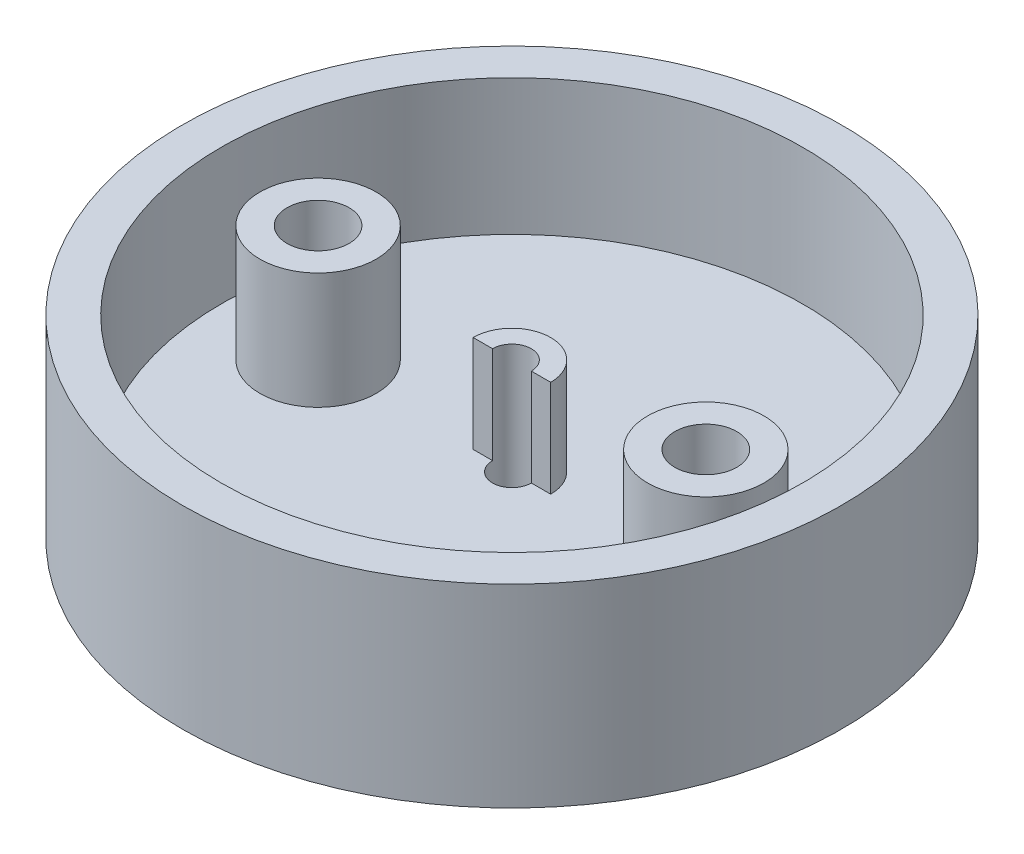
ISO-10303-21;
HEADER;
FILE_DESCRIPTION(('STEP AP214'),'2;1');
FILE_NAME('part.step','',(''),(''),'','','');
FILE_SCHEMA(('AUTOMOTIVE_DESIGN { 1 0 10303 214 1 1 1 1 }'));
ENDSEC;
DATA;
#1=APPLICATION_CONTEXT('core data for automotive mechanical design processes');
#2=APPLICATION_PROTOCOL_DEFINITION('international standard','automotive_design',2000,#1);
#3=PRODUCT_CONTEXT('',#1,'mechanical');
#4=PRODUCT('Part','Part','',(#3));
#5=PRODUCT_RELATED_PRODUCT_CATEGORY('part','',(#4));
#6=PRODUCT_DEFINITION_FORMATION('','',#4);
#7=PRODUCT_DEFINITION_CONTEXT('part definition',#1,'design');
#8=PRODUCT_DEFINITION('design','',#6,#7);
#9=PRODUCT_DEFINITION_SHAPE('','',#8);
#10=(LENGTH_UNIT() NAMED_UNIT(*) SI_UNIT(.MILLI.,.METRE.));
#11=(NAMED_UNIT(*) PLANE_ANGLE_UNIT() SI_UNIT($,.RADIAN.));
#12=(NAMED_UNIT(*) SI_UNIT($,.STERADIAN.) SOLID_ANGLE_UNIT());
#13=UNCERTAINTY_MEASURE_WITH_UNIT(LENGTH_MEASURE(1.E-05),#10,'distance_accuracy_value','');
#14=(GEOMETRIC_REPRESENTATION_CONTEXT(3) GLOBAL_UNCERTAINTY_ASSIGNED_CONTEXT((#13)) GLOBAL_UNIT_ASSIGNED_CONTEXT((#10,
#11,#12)) REPRESENTATION_CONTEXT('',''));
#15=CARTESIAN_POINT('',(0.,0.,0.));
#16=DIRECTION('',(0.,0.,1.));
#17=DIRECTION('',(1.,0.,0.));
#18=AXIS2_PLACEMENT_3D('',#15,#16,#17);
#19=CARTESIAN_POINT('',(0.,3.,0.));
#20=DIRECTION('',(0.,1.,0.));
#21=DIRECTION('',(0.,0.,1.));
#22=AXIS2_PLACEMENT_3D('',#19,#20,#21);
#23=PLANE('',#22);
#24=CARTESIAN_POINT('',(10.,3.,0.));
#25=DIRECTION('',(0.,1.,0.));
#26=DIRECTION('',(0.,0.,1.));
#27=AXIS2_PLACEMENT_3D('',#24,#25,#26);
#28=CIRCLE('',#27,3.);
#29=CARTESIAN_POINT('',(10.,3.,3.));
#30=VERTEX_POINT('',#29);
#31=EDGE_CURVE('E118',#30,#30,#28,.T.);
#32=ORIENTED_EDGE('',*,*,#31,.F.);
#33=EDGE_LOOP('',(#32));
#34=FACE_BOUND('',#33,.T.);
#35=CARTESIAN_POINT('',(0.,3.,0.));
#36=DIRECTION('',(0.,1.,0.));
#37=DIRECTION('',(0.,0.,1.));
#38=AXIS2_PLACEMENT_3D('',#35,#36,#37);
#39=CIRCLE('',#38,15.);
#40=CARTESIAN_POINT('',(0.,3.,15.));
#41=VERTEX_POINT('',#40);
#42=EDGE_CURVE('E11',#41,#41,#39,.F.);
#43=ORIENTED_EDGE('',*,*,#42,.F.);
#44=EDGE_LOOP('',(#43));
#45=FACE_BOUND('',#44,.T.);
#46=CARTESIAN_POINT('',(-10.,3.,0.));
#47=DIRECTION('',(0.,1.,0.));
#48=DIRECTION('',(0.,0.,1.));
#49=AXIS2_PLACEMENT_3D('',#46,#47,#48);
#50=CIRCLE('',#49,3.);
#51=CARTESIAN_POINT('',(-10.,3.,3.));
#52=VERTEX_POINT('',#51);
#53=EDGE_CURVE('E109',#52,#52,#50,.T.);
#54=ORIENTED_EDGE('',*,*,#53,.F.);
#55=EDGE_LOOP('',(#54));
#56=FACE_BOUND('',#55,.T.);
#57=CARTESIAN_POINT('',(0.,3.,0.));
#58=DIRECTION('',(0.,1.,0.));
#59=DIRECTION('',(0.,0.,1.));
#60=AXIS2_PLACEMENT_3D('',#57,#58,#59);
#61=CIRCLE('',#60,2.);
#62=CARTESIAN_POINT('',(2.,3.,0.));
#63=VERTEX_POINT('',#62);
#64=CARTESIAN_POINT('',(-2.,3.,0.));
#65=VERTEX_POINT('',#64);
#66=EDGE_CURVE('E73',#63,#65,#61,.T.);
#67=ORIENTED_EDGE('',*,*,#66,.F.);
#68=DIRECTION('',(1.,0.,0.));
#69=VECTOR('',#68,1.);
#70=CARTESIAN_POINT('',(1.,3.,0.));
#71=LINE('',#70,#69);
#72=CARTESIAN_POINT('',(1.,3.,0.));
#73=VERTEX_POINT('',#72);
#74=EDGE_CURVE('E90',#73,#63,#71,.T.);
#75=ORIENTED_EDGE('',*,*,#74,.F.);
#76=CARTESIAN_POINT('',(0.,3.,0.));
#77=DIRECTION('',(0.,1.,0.));
#78=DIRECTION('',(0.,0.,1.));
#79=AXIS2_PLACEMENT_3D('',#76,#77,#78);
#80=CIRCLE('',#79,1.);
#81=CARTESIAN_POINT('',(-1.,3.,0.));
#82=VERTEX_POINT('',#81);
#83=EDGE_CURVE('E137',#82,#73,#80,.T.);
#84=ORIENTED_EDGE('',*,*,#83,.F.);
#85=DIRECTION('',(1.,0.,0.));
#86=VECTOR('',#85,1.);
#87=CARTESIAN_POINT('',(-1.,3.,0.));
#88=LINE('',#87,#86);
#89=EDGE_CURVE('E101',#65,#82,#88,.T.);
#90=ORIENTED_EDGE('',*,*,#89,.F.);
#91=EDGE_LOOP('',(#67,#75,#84,#90));
#92=FACE_BOUND('',#91,.T.);
#93=ADVANCED_FACE('F32',(#34,#45,#56,#92),#23,.T.);
#94=CARTESIAN_POINT('',(0.,0.,0.));
#95=DIRECTION('',(0.,1.,0.));
#96=DIRECTION('',(0.,0.,1.));
#97=AXIS2_PLACEMENT_3D('',#94,#95,#96);
#98=PLANE('',#97);
#99=CARTESIAN_POINT('',(0.,0.,0.));
#100=DIRECTION('',(0.,1.,0.));
#101=DIRECTION('',(0.,0.,1.));
#102=AXIS2_PLACEMENT_3D('',#99,#100,#101);
#103=CIRCLE('',#102,17.);
#104=CARTESIAN_POINT('',(0.,0.,17.));
#105=VERTEX_POINT('',#104);
#106=EDGE_CURVE('E40',#105,#105,#103,.T.);
#107=ORIENTED_EDGE('',*,*,#106,.F.);
#108=EDGE_LOOP('',(#107));
#109=FACE_BOUND('',#108,.T.);
#110=CARTESIAN_POINT('',(0.,0.,0.));
#111=DIRECTION('',(0.,1.,0.));
#112=DIRECTION('',(0.,0.,1.));
#113=AXIS2_PLACEMENT_3D('',#110,#111,#112);
#114=CIRCLE('',#113,1.);
#115=CARTESIAN_POINT('',(0.,0.,1.));
#116=VERTEX_POINT('',#115);
#117=EDGE_CURVE('E136',#116,#116,#114,.T.);
#118=ORIENTED_EDGE('',*,*,#117,.T.);
#119=EDGE_LOOP('',(#118));
#120=FACE_BOUND('',#119,.T.);
#121=CARTESIAN_POINT('',(-10.,0.,0.));
#122=DIRECTION('',(0.,1.,0.));
#123=DIRECTION('',(0.,0.,1.));
#124=AXIS2_PLACEMENT_3D('',#121,#122,#123);
#125=CIRCLE('',#124,1.6);
#126=CARTESIAN_POINT('',(-10.,0.,1.6));
#127=VERTEX_POINT('',#126);
#128=EDGE_CURVE('E133',#127,#127,#125,.T.);
#129=ORIENTED_EDGE('',*,*,#128,.T.);
#130=EDGE_LOOP('',(#129));
#131=FACE_BOUND('',#130,.T.);
#132=CARTESIAN_POINT('',(10.,0.,0.));
#133=DIRECTION('',(0.,1.,0.));
#134=DIRECTION('',(0.,0.,1.));
#135=AXIS2_PLACEMENT_3D('',#132,#133,#134);
#136=CIRCLE('',#135,1.6);
#137=CARTESIAN_POINT('',(10.,0.,1.6));
#138=VERTEX_POINT('',#137);
#139=EDGE_CURVE('E130',#138,#138,#136,.T.);
#140=ORIENTED_EDGE('',*,*,#139,.T.);
#141=EDGE_LOOP('',(#140));
#142=FACE_BOUND('',#141,.T.);
#143=ADVANCED_FACE('F145',(#109,#120,#131,#142),#98,.F.);
#144=CARTESIAN_POINT('',(0.,3.,0.));
#145=DIRECTION('',(0.,-1.,0.));
#146=DIRECTION('',(0.,0.,-1.));
#147=AXIS2_PLACEMENT_3D('',#144,#145,#146);
#148=CYLINDRICAL_SURFACE('',#147,17.);
#149=ORIENTED_EDGE('',*,*,#106,.T.);
#150=EDGE_LOOP('',(#149));
#151=FACE_BOUND('',#150,.T.);
#152=CARTESIAN_POINT('',(0.,10.,0.));
#153=DIRECTION('',(0.,1.,0.));
#154=DIRECTION('',(0.,0.,1.));
#155=AXIS2_PLACEMENT_3D('',#152,#153,#154);
#156=CIRCLE('',#155,17.);
#157=CARTESIAN_POINT('',(0.,10.,17.));
#158=VERTEX_POINT('',#157);
#159=EDGE_CURVE('E127',#158,#158,#156,.T.);
#160=ORIENTED_EDGE('',*,*,#159,.F.);
#161=EDGE_LOOP('',(#160));
#162=FACE_BOUND('',#161,.T.);
#163=ADVANCED_FACE('F34',(#151,#162),#148,.T.);
#164=CARTESIAN_POINT('',(0.,3.,0.));
#165=DIRECTION('',(0.,-1.,0.));
#166=DIRECTION('',(0.,0.,-1.));
#167=AXIS2_PLACEMENT_3D('',#164,#165,#166);
#168=CYLINDRICAL_SURFACE('',#167,1.);
#169=ORIENTED_EDGE('',*,*,#83,.T.);
#170=DIRECTION('',(0.,-1.,0.));
#171=VECTOR('',#170,1.);
#172=CARTESIAN_POINT('',(1.,8.,0.));
#173=LINE('',#172,#171);
#174=CARTESIAN_POINT('',(1.,8.,0.));
#175=VERTEX_POINT('',#174);
#176=EDGE_CURVE('E91',#175,#73,#173,.T.);
#177=ORIENTED_EDGE('',*,*,#176,.F.);
#178=CARTESIAN_POINT('',(0.,8.,0.));
#179=DIRECTION('',(0.,-1.,0.));
#180=DIRECTION('',(0.,0.,1.));
#181=AXIS2_PLACEMENT_3D('',#178,#179,#180);
#182=CIRCLE('',#181,1.);
#183=CARTESIAN_POINT('',(-1.,8.,0.));
#184=VERTEX_POINT('',#183);
#185=EDGE_CURVE('E84',#184,#175,#182,.T.);
#186=ORIENTED_EDGE('',*,*,#185,.F.);
#187=DIRECTION('',(0.,-1.,0.));
#188=VECTOR('',#187,1.);
#189=CARTESIAN_POINT('',(-1.,8.,0.));
#190=LINE('',#189,#188);
#191=EDGE_CURVE('E47',#184,#82,#190,.T.);
#192=ORIENTED_EDGE('',*,*,#191,.T.);
#193=EDGE_LOOP('',(#169,#177,#186,#192));
#194=FACE_BOUND('',#193,.T.);
#195=ORIENTED_EDGE('',*,*,#117,.F.);
#196=EDGE_LOOP('',(#195));
#197=FACE_BOUND('',#196,.T.);
#198=ADVANCED_FACE('F186',(#194,#197),#168,.F.);
#199=CARTESIAN_POINT('',(-10.,3.,0.));
#200=DIRECTION('',(0.,-1.,0.));
#201=DIRECTION('',(0.,0.,-1.));
#202=AXIS2_PLACEMENT_3D('',#199,#200,#201);
#203=CYLINDRICAL_SURFACE('',#202,1.6);
#204=ORIENTED_EDGE('',*,*,#128,.F.);
#205=EDGE_LOOP('',(#204));
#206=FACE_BOUND('',#205,.T.);
#207=CARTESIAN_POINT('',(-10.,9.,0.));
#208=DIRECTION('',(0.,1.,0.));
#209=DIRECTION('',(0.,0.,1.));
#210=AXIS2_PLACEMENT_3D('',#207,#208,#209);
#211=CIRCLE('',#210,1.6);
#212=CARTESIAN_POINT('',(-10.,9.,1.6));
#213=VERTEX_POINT('',#212);
#214=EDGE_CURVE('E106',#213,#213,#211,.T.);
#215=ORIENTED_EDGE('',*,*,#214,.T.);
#216=EDGE_LOOP('',(#215));
#217=FACE_BOUND('',#216,.T.);
#218=ADVANCED_FACE('F158',(#206,#217),#203,.F.);
#219=CARTESIAN_POINT('',(10.,3.,0.));
#220=DIRECTION('',(0.,-1.,0.));
#221=DIRECTION('',(0.,0.,-1.));
#222=AXIS2_PLACEMENT_3D('',#219,#220,#221);
#223=CYLINDRICAL_SURFACE('',#222,1.6);
#224=ORIENTED_EDGE('',*,*,#139,.F.);
#225=EDGE_LOOP('',(#224));
#226=FACE_BOUND('',#225,.T.);
#227=CARTESIAN_POINT('',(10.,9.,0.));
#228=DIRECTION('',(0.,1.,0.));
#229=DIRECTION('',(0.,0.,1.));
#230=AXIS2_PLACEMENT_3D('',#227,#228,#229);
#231=CIRCLE('',#230,1.6);
#232=CARTESIAN_POINT('',(10.,9.,1.6));
#233=VERTEX_POINT('',#232);
#234=EDGE_CURVE('E113',#233,#233,#231,.T.);
#235=ORIENTED_EDGE('',*,*,#234,.T.);
#236=EDGE_LOOP('',(#235));
#237=FACE_BOUND('',#236,.T.);
#238=ADVANCED_FACE('F154',(#226,#237),#223,.F.);
#239=CARTESIAN_POINT('',(0.,10.,0.));
#240=DIRECTION('',(0.,1.,0.));
#241=DIRECTION('',(0.,0.,1.));
#242=AXIS2_PLACEMENT_3D('',#239,#240,#241);
#243=PLANE('',#242);
#244=ORIENTED_EDGE('',*,*,#159,.T.);
#245=EDGE_LOOP('',(#244));
#246=FACE_BOUND('',#245,.T.);
#247=CARTESIAN_POINT('',(0.,10.,0.));
#248=DIRECTION('',(0.,1.,0.));
#249=DIRECTION('',(0.,0.,1.));
#250=AXIS2_PLACEMENT_3D('',#247,#248,#249);
#251=CIRCLE('',#250,15.);
#252=CARTESIAN_POINT('',(0.,10.,15.));
#253=VERTEX_POINT('',#252);
#254=EDGE_CURVE('E122',#253,#253,#251,.T.);
#255=ORIENTED_EDGE('',*,*,#254,.F.);
#256=EDGE_LOOP('',(#255));
#257=FACE_BOUND('',#256,.T.);
#258=ADVANCED_FACE('F157',(#246,#257),#243,.T.);
#259=CARTESIAN_POINT('',(0.,10.,0.));
#260=DIRECTION('',(0.,-1.,0.));
#261=DIRECTION('',(0.,0.,-1.));
#262=AXIS2_PLACEMENT_3D('',#259,#260,#261);
#263=CYLINDRICAL_SURFACE('',#262,15.);
#264=ORIENTED_EDGE('',*,*,#254,.T.);
#265=EDGE_LOOP('',(#264));
#266=FACE_BOUND('',#265,.T.);
#267=ORIENTED_EDGE('',*,*,#42,.T.);
#268=EDGE_LOOP('',(#267));
#269=FACE_BOUND('',#268,.T.);
#270=ADVANCED_FACE('F165',(#266,#269),#263,.F.);
#271=CARTESIAN_POINT('',(10.,9.,0.));
#272=DIRECTION('',(0.,1.,0.));
#273=DIRECTION('',(0.,0.,1.));
#274=AXIS2_PLACEMENT_3D('',#271,#272,#273);
#275=PLANE('',#274);
#276=CARTESIAN_POINT('',(10.,9.,0.));
#277=DIRECTION('',(0.,1.,0.));
#278=DIRECTION('',(0.,0.,1.));
#279=AXIS2_PLACEMENT_3D('',#276,#277,#278);
#280=CIRCLE('',#279,3.);
#281=CARTESIAN_POINT('',(10.,9.,3.));
#282=VERTEX_POINT('',#281);
#283=EDGE_CURVE('E119',#282,#282,#280,.T.);
#284=ORIENTED_EDGE('',*,*,#283,.T.);
#285=EDGE_LOOP('',(#284));
#286=FACE_BOUND('',#285,.T.);
#287=ORIENTED_EDGE('',*,*,#234,.F.);
#288=EDGE_LOOP('',(#287));
#289=FACE_BOUND('',#288,.T.);
#290=ADVANCED_FACE('F162',(#286,#289),#275,.T.);
#291=CARTESIAN_POINT('',(10.,9.,0.));
#292=DIRECTION('',(0.,-1.,0.));
#293=DIRECTION('',(0.,0.,-1.));
#294=AXIS2_PLACEMENT_3D('',#291,#292,#293);
#295=CYLINDRICAL_SURFACE('',#294,3.);
#296=ORIENTED_EDGE('',*,*,#283,.F.);
#297=EDGE_LOOP('',(#296));
#298=FACE_BOUND('',#297,.T.);
#299=ORIENTED_EDGE('',*,*,#31,.T.);
#300=EDGE_LOOP('',(#299));
#301=FACE_BOUND('',#300,.T.);
#302=ADVANCED_FACE('F164',(#298,#301),#295,.T.);
#303=CARTESIAN_POINT('',(-10.,9.,0.));
#304=DIRECTION('',(0.,1.,0.));
#305=DIRECTION('',(0.,0.,1.));
#306=AXIS2_PLACEMENT_3D('',#303,#304,#305);
#307=PLANE('',#306);
#308=CARTESIAN_POINT('',(-10.,9.,0.));
#309=DIRECTION('',(0.,1.,0.));
#310=DIRECTION('',(0.,0.,1.));
#311=AXIS2_PLACEMENT_3D('',#308,#309,#310);
#312=CIRCLE('',#311,3.);
#313=CARTESIAN_POINT('',(-10.,9.,3.));
#314=VERTEX_POINT('',#313);
#315=EDGE_CURVE('E110',#314,#314,#312,.T.);
#316=ORIENTED_EDGE('',*,*,#315,.T.);
#317=EDGE_LOOP('',(#316));
#318=FACE_BOUND('',#317,.T.);
#319=ORIENTED_EDGE('',*,*,#214,.F.);
#320=EDGE_LOOP('',(#319));
#321=FACE_BOUND('',#320,.T.);
#322=ADVANCED_FACE('F172',(#318,#321),#307,.T.);
#323=CARTESIAN_POINT('',(-10.,9.,0.));
#324=DIRECTION('',(0.,-1.,0.));
#325=DIRECTION('',(0.,0.,-1.));
#326=AXIS2_PLACEMENT_3D('',#323,#324,#325);
#327=CYLINDRICAL_SURFACE('',#326,3.);
#328=ORIENTED_EDGE('',*,*,#315,.F.);
#329=EDGE_LOOP('',(#328));
#330=FACE_BOUND('',#329,.T.);
#331=ORIENTED_EDGE('',*,*,#53,.T.);
#332=EDGE_LOOP('',(#331));
#333=FACE_BOUND('',#332,.T.);
#334=ADVANCED_FACE('F220',(#330,#333),#327,.T.);
#335=CARTESIAN_POINT('',(1.,8.,0.));
#336=DIRECTION('',(0.,0.,-1.));
#337=DIRECTION('',(-1.,0.,0.));
#338=AXIS2_PLACEMENT_3D('',#335,#336,#337);
#339=PLANE('',#338);
#340=ORIENTED_EDGE('',*,*,#74,.T.);
#341=DIRECTION('',(0.,-1.,0.));
#342=VECTOR('',#341,1.);
#343=CARTESIAN_POINT('',(2.,8.,0.));
#344=LINE('',#343,#342);
#345=CARTESIAN_POINT('',(2.,8.,0.));
#346=VERTEX_POINT('',#345);
#347=EDGE_CURVE('E87',#346,#63,#344,.T.);
#348=ORIENTED_EDGE('',*,*,#347,.F.);
#349=DIRECTION('',(1.,0.,0.));
#350=VECTOR('',#349,1.);
#351=CARTESIAN_POINT('',(1.,8.,0.));
#352=LINE('',#351,#350);
#353=EDGE_CURVE('E80',#175,#346,#352,.T.);
#354=ORIENTED_EDGE('',*,*,#353,.F.);
#355=ORIENTED_EDGE('',*,*,#176,.T.);
#356=EDGE_LOOP('',(#340,#348,#354,#355));
#357=FACE_BOUND('',#356,.T.);
#358=ADVANCED_FACE('F88',(#357),#339,.F.);
#359=CARTESIAN_POINT('',(0.,8.,0.));
#360=DIRECTION('',(0.,-1.,0.));
#361=DIRECTION('',(0.,0.,-1.));
#362=AXIS2_PLACEMENT_3D('',#359,#360,#361);
#363=CYLINDRICAL_SURFACE('',#362,2.);
#364=ORIENTED_EDGE('',*,*,#66,.T.);
#365=DIRECTION('',(0.,-1.,0.));
#366=VECTOR('',#365,1.);
#367=CARTESIAN_POINT('',(-2.,8.,0.));
#368=LINE('',#367,#366);
#369=CARTESIAN_POINT('',(-2.,8.,0.));
#370=VERTEX_POINT('',#369);
#371=EDGE_CURVE('E92',#370,#65,#368,.T.);
#372=ORIENTED_EDGE('',*,*,#371,.F.);
#373=CARTESIAN_POINT('',(0.,8.,0.));
#374=DIRECTION('',(0.,1.,0.));
#375=DIRECTION('',(0.,0.,1.));
#376=AXIS2_PLACEMENT_3D('',#373,#374,#375);
#377=CIRCLE('',#376,2.);
#378=EDGE_CURVE('E83',#346,#370,#377,.T.);
#379=ORIENTED_EDGE('',*,*,#378,.F.);
#380=ORIENTED_EDGE('',*,*,#347,.T.);
#381=EDGE_LOOP('',(#364,#372,#379,#380));
#382=FACE_BOUND('',#381,.T.);
#383=ADVANCED_FACE('F94',(#382),#363,.T.);
#384=CARTESIAN_POINT('',(-1.,8.,0.));
#385=DIRECTION('',(0.,0.,-1.));
#386=DIRECTION('',(-1.,0.,0.));
#387=AXIS2_PLACEMENT_3D('',#384,#385,#386);
#388=PLANE('',#387);
#389=ORIENTED_EDGE('',*,*,#89,.T.);
#390=ORIENTED_EDGE('',*,*,#191,.F.);
#391=DIRECTION('',(1.,0.,0.));
#392=VECTOR('',#391,1.);
#393=CARTESIAN_POINT('',(-1.,8.,0.));
#394=LINE('',#393,#392);
#395=EDGE_CURVE('E56',#370,#184,#394,.T.);
#396=ORIENTED_EDGE('',*,*,#395,.F.);
#397=ORIENTED_EDGE('',*,*,#371,.T.);
#398=EDGE_LOOP('',(#389,#390,#396,#397));
#399=FACE_BOUND('',#398,.T.);
#400=ADVANCED_FACE('F207',(#399),#388,.F.);
#401=CARTESIAN_POINT('',(0.,8.,0.));
#402=DIRECTION('',(0.,1.,0.));
#403=DIRECTION('',(0.,0.,1.));
#404=AXIS2_PLACEMENT_3D('',#401,#402,#403);
#405=PLANE('',#404);
#406=ORIENTED_EDGE('',*,*,#185,.T.);
#407=ORIENTED_EDGE('',*,*,#353,.T.);
#408=ORIENTED_EDGE('',*,*,#378,.T.);
#409=ORIENTED_EDGE('',*,*,#395,.T.);
#410=EDGE_LOOP('',(#406,#407,#408,#409));
#411=FACE_BOUND('',#410,.T.);
#412=ADVANCED_FACE('F81',(#411),#405,.T.);
#413=CLOSED_SHELL('',(#93,#143,#163,#198,#218,#238,#258,#270,#290,#302,#322,#334,#358,#383,#400,#412));
#414=MANIFOLD_SOLID_BREP('B2',#413);
#415=ADVANCED_BREP_SHAPE_REPRESENTATION('',(#18,#414),#14);
#416=SHAPE_DEFINITION_REPRESENTATION(#9,#415);
ENDSEC;
END-ISO-10303-21;
